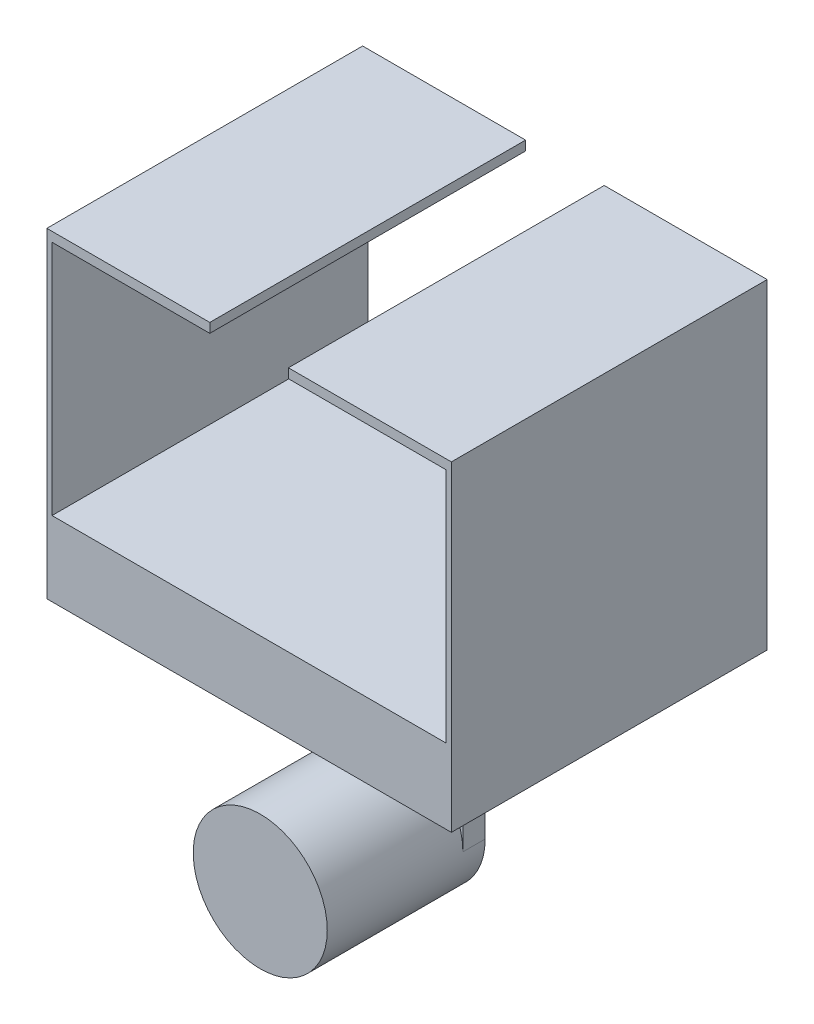
ISO-10303-21;
HEADER;
FILE_DESCRIPTION(('STEP AP214'),'2;1');
FILE_NAME('part.step','',(''),(''),'','','');
FILE_SCHEMA(('AUTOMOTIVE_DESIGN { 1 0 10303 214 1 1 1 1 }'));
ENDSEC;
DATA;
#1=APPLICATION_CONTEXT('core data for automotive mechanical design processes');
#2=APPLICATION_PROTOCOL_DEFINITION('international standard','automotive_design',2000,#1);
#3=PRODUCT_CONTEXT('',#1,'mechanical');
#4=PRODUCT('Part','Part','',(#3));
#5=PRODUCT_RELATED_PRODUCT_CATEGORY('part','',(#4));
#6=PRODUCT_DEFINITION_FORMATION('','',#4);
#7=PRODUCT_DEFINITION_CONTEXT('part definition',#1,'design');
#8=PRODUCT_DEFINITION('design','',#6,#7);
#9=PRODUCT_DEFINITION_SHAPE('','',#8);
#10=(LENGTH_UNIT() NAMED_UNIT(*) SI_UNIT(.MILLI.,.METRE.));
#11=(NAMED_UNIT(*) PLANE_ANGLE_UNIT() SI_UNIT($,.RADIAN.));
#12=(NAMED_UNIT(*) SI_UNIT($,.STERADIAN.) SOLID_ANGLE_UNIT());
#13=UNCERTAINTY_MEASURE_WITH_UNIT(LENGTH_MEASURE(1.E-05),#10,'distance_accuracy_value','');
#14=(GEOMETRIC_REPRESENTATION_CONTEXT(3) GLOBAL_UNCERTAINTY_ASSIGNED_CONTEXT((#13)) GLOBAL_UNIT_ASSIGNED_CONTEXT((#10,
#11,#12)) REPRESENTATION_CONTEXT('',''));
#15=CARTESIAN_POINT('',(0.,0.,0.));
#16=DIRECTION('',(0.,0.,1.));
#17=DIRECTION('',(1.,0.,0.));
#18=AXIS2_PLACEMENT_3D('',#15,#16,#17);
#19=CARTESIAN_POINT('',(-32.5374,77.0128,1.7907));
#20=DIRECTION('',(0.,0.,-1.));
#21=DIRECTION('',(-1.,0.,0.));
#22=AXIS2_PLACEMENT_3D('',#19,#20,#21);
#23=PLANE('',#22);
#24=DIRECTION('',(0.,-1.,0.));
#25=VECTOR('',#24,1.);
#26=CARTESIAN_POINT('',(-6.3246,75.4888,1.79069999999999));
#27=LINE('',#26,#25);
#28=CARTESIAN_POINT('',(-6.3246,77.0128,1.79069999999999));
#29=VERTEX_POINT('',#28);
#30=CARTESIAN_POINT('',(-6.3246,75.4888,1.79069999999999));
#31=VERTEX_POINT('',#30);
#32=EDGE_CURVE('E888',#29,#31,#27,.T.);
#33=ORIENTED_EDGE('',*,*,#32,.F.);
#34=DIRECTION('',(1.,0.,0.));
#35=VECTOR('',#34,1.);
#36=CARTESIAN_POINT('',(-32.5374,77.0128,1.7907));
#37=LINE('',#36,#35);
#38=CARTESIAN_POINT('',(-32.5374,77.0128,1.7907));
#39=VERTEX_POINT('',#38);
#40=EDGE_CURVE('E1052',#39,#29,#37,.T.);
#41=ORIENTED_EDGE('',*,*,#40,.F.);
#42=DIRECTION('',(0.,-1.,0.));
#43=VECTOR('',#42,1.);
#44=CARTESIAN_POINT('',(-32.5374,77.0128,1.7907));
#45=LINE('',#44,#43);
#46=CARTESIAN_POINT('',(-32.5374,25.4,1.7907));
#47=VERTEX_POINT('',#46);
#48=EDGE_CURVE('E1084',#39,#47,#45,.T.);
#49=ORIENTED_EDGE('',*,*,#48,.T.);
#50=DIRECTION('',(1.,0.,0.));
#51=VECTOR('',#50,1.);
#52=CARTESIAN_POINT('',(-32.5374,25.4,1.7907));
#53=LINE('',#52,#51);
#54=CARTESIAN_POINT('',(32.5374,25.4,1.79069999999997));
#55=VERTEX_POINT('',#54);
#56=EDGE_CURVE('E1067',#47,#55,#53,.T.);
#57=ORIENTED_EDGE('',*,*,#56,.T.);
#58=DIRECTION('',(0.,-1.,0.));
#59=VECTOR('',#58,1.);
#60=CARTESIAN_POINT('',(32.5374,77.0128,1.79069999999997));
#61=LINE('',#60,#59);
#62=CARTESIAN_POINT('',(32.5374,77.0128,1.79069999999997));
#63=VERTEX_POINT('',#62);
#64=EDGE_CURVE('E1081',#63,#55,#61,.T.);
#65=ORIENTED_EDGE('',*,*,#64,.F.);
#66=CARTESIAN_POINT('',(6.3246,77.0128,1.79069999999999));
#67=VERTEX_POINT('',#66);
#68=EDGE_CURVE('E1046',#67,#63,#37,.T.);
#69=ORIENTED_EDGE('',*,*,#68,.F.);
#70=DIRECTION('',(0.,1.,0.));
#71=VECTOR('',#70,1.);
#72=CARTESIAN_POINT('',(6.3246,75.4888,1.79069999999999));
#73=LINE('',#72,#71);
#74=CARTESIAN_POINT('',(6.3246,75.4888,1.79069999999999));
#75=VERTEX_POINT('',#74);
#76=EDGE_CURVE('E995',#75,#67,#73,.T.);
#77=ORIENTED_EDGE('',*,*,#76,.F.);
#78=DIRECTION('',(-1.,0.,0.));
#79=VECTOR('',#78,1.);
#80=CARTESIAN_POINT('',(-31.70428,75.4888,1.79069999999999));
#81=LINE('',#80,#79);
#82=CARTESIAN_POINT('',(31.70428,75.4888,1.79069999999999));
#83=VERTEX_POINT('',#82);
#84=EDGE_CURVE('E1027',#83,#75,#81,.T.);
#85=ORIENTED_EDGE('',*,*,#84,.F.);
#86=DIRECTION('',(0.,1.,0.));
#87=VECTOR('',#86,1.);
#88=CARTESIAN_POINT('',(31.70428,37.4142,1.79069999999999));
#89=LINE('',#88,#87);
#90=CARTESIAN_POINT('',(31.70428,37.4142,1.79069999999999));
#91=VERTEX_POINT('',#90);
#92=EDGE_CURVE('E1023',#91,#83,#89,.T.);
#93=ORIENTED_EDGE('',*,*,#92,.F.);
#94=DIRECTION('',(1.,0.,0.));
#95=VECTOR('',#94,1.);
#96=CARTESIAN_POINT('',(-31.70428,37.4142,1.79069999999999));
#97=LINE('',#96,#95);
#98=CARTESIAN_POINT('',(-31.70428,37.4142,1.7907));
#99=VERTEX_POINT('',#98);
#100=EDGE_CURVE('E1018',#99,#91,#97,.T.);
#101=ORIENTED_EDGE('',*,*,#100,.F.);
#102=DIRECTION('',(0.,-1.,0.));
#103=VECTOR('',#102,1.);
#104=CARTESIAN_POINT('',(-31.70428,37.4142,1.79069999999999));
#105=LINE('',#104,#103);
#106=CARTESIAN_POINT('',(-31.70428,75.4888,1.79069999999999));
#107=VERTEX_POINT('',#106);
#108=EDGE_CURVE('E1012',#107,#99,#105,.T.);
#109=ORIENTED_EDGE('',*,*,#108,.F.);
#110=EDGE_CURVE('E1030',#31,#107,#81,.T.);
#111=ORIENTED_EDGE('',*,*,#110,.F.);
#112=EDGE_LOOP('',(#33,#41,#49,#57,#65,#69,#77,#85,#93,#101,#109,#111));
#113=FACE_BOUND('',#112,.T.);
#114=ADVANCED_FACE('F863',(#113),#23,.F.);
#115=CARTESIAN_POINT('',(0.,77.0128,0.));
#116=DIRECTION('',(0.,1.,0.));
#117=DIRECTION('',(0.,0.,1.));
#118=AXIS2_PLACEMENT_3D('',#115,#116,#117);
#119=PLANE('',#118);
#120=DIRECTION('',(-1.,0.,0.));
#121=VECTOR('',#120,1.);
#122=CARTESIAN_POINT('',(-32.5374,77.0128,-49.0093));
#123=LINE('',#122,#121);
#124=CARTESIAN_POINT('',(32.5374,77.0128,-49.0093));
#125=VERTEX_POINT('',#124);
#126=CARTESIAN_POINT('',(6.3246,77.0128,-49.0093));
#127=VERTEX_POINT('',#126);
#128=EDGE_CURVE('E1059',#125,#127,#123,.T.);
#129=ORIENTED_EDGE('',*,*,#128,.T.);
#130=DIRECTION('',(0.,0.,1.));
#131=VECTOR('',#130,1.);
#132=CARTESIAN_POINT('',(6.3246,77.0128,-49.0093));
#133=LINE('',#132,#131);
#134=EDGE_CURVE('E1320',#127,#67,#133,.T.);
#135=ORIENTED_EDGE('',*,*,#134,.T.);
#136=ORIENTED_EDGE('',*,*,#68,.T.);
#137=DIRECTION('',(0.,0.,-1.));
#138=VECTOR('',#137,1.);
#139=CARTESIAN_POINT('',(32.5374,77.0128,-49.0093));
#140=LINE('',#139,#138);
#141=EDGE_CURVE('E1053',#63,#125,#140,.T.);
#142=ORIENTED_EDGE('',*,*,#141,.T.);
#143=EDGE_LOOP('',(#129,#135,#136,#142));
#144=FACE_BOUND('',#143,.T.);
#145=ADVANCED_FACE('F1146',(#144),#119,.T.);
#146=CARTESIAN_POINT('',(-31.70428,75.4888,-49.0093));
#147=DIRECTION('',(0.,1.,0.));
#148=DIRECTION('',(-1.,0.,0.));
#149=AXIS2_PLACEMENT_3D('',#146,#147,#148);
#150=PLANE('',#149);
#151=DIRECTION('',(0.,0.,1.));
#152=VECTOR('',#151,1.);
#153=CARTESIAN_POINT('',(6.3246,75.4888,-49.0093));
#154=LINE('',#153,#152);
#155=CARTESIAN_POINT('',(6.3246,75.4888,-49.0093));
#156=VERTEX_POINT('',#155);
#157=EDGE_CURVE('E981',#156,#75,#154,.T.);
#158=ORIENTED_EDGE('',*,*,#157,.F.);
#159=DIRECTION('',(-1.,0.,0.));
#160=VECTOR('',#159,1.);
#161=CARTESIAN_POINT('',(-31.70428,75.4888,-49.0093));
#162=LINE('',#161,#160);
#163=CARTESIAN_POINT('',(31.70428,75.4888,-49.0093));
#164=VERTEX_POINT('',#163);
#165=EDGE_CURVE('E1005',#164,#156,#162,.T.);
#166=ORIENTED_EDGE('',*,*,#165,.F.);
#167=DIRECTION('',(0.,0.,1.));
#168=VECTOR('',#167,1.);
#169=CARTESIAN_POINT('',(31.70428,75.4888,-49.0093));
#170=LINE('',#169,#168);
#171=EDGE_CURVE('E1036',#164,#83,#170,.T.);
#172=ORIENTED_EDGE('',*,*,#171,.T.);
#173=ORIENTED_EDGE('',*,*,#84,.T.);
#174=EDGE_LOOP('',(#158,#166,#172,#173));
#175=FACE_BOUND('',#174,.T.);
#176=ADVANCED_FACE('F1137',(#175),#150,.F.);
#177=CARTESIAN_POINT('',(0.,0.,-25.4));
#178=DIRECTION('',(0.,0.,1.));
#179=DIRECTION('',(1.,0.,0.));
#180=AXIS2_PLACEMENT_3D('',#177,#178,#179);
#181=CYLINDRICAL_SURFACE('',#180,10.7823);
#182=DIRECTION('',(0.,0.,-1.));
#183=VECTOR('',#182,1.);
#184=CARTESIAN_POINT('',(10.7823,0.,-21.8186));
#185=LINE('',#184,#183);
#186=CARTESIAN_POINT('',(10.7823,0.,-21.8186));
#187=VERTEX_POINT('',#186);
#188=CARTESIAN_POINT('',(10.7823,0.,-25.4));
#189=VERTEX_POINT('',#188);
#190=EDGE_CURVE('E1102',#187,#189,#185,.T.);
#191=ORIENTED_EDGE('',*,*,#190,.F.);
#192=CARTESIAN_POINT('',(0.,0.,-21.8186));
#193=DIRECTION('',(0.,0.,-1.));
#194=DIRECTION('',(-1.,0.,0.));
#195=AXIS2_PLACEMENT_3D('',#192,#193,#194);
#196=CIRCLE('',#195,10.7823);
#197=CARTESIAN_POINT('',(-10.7823,0.,-21.8186));
#198=VERTEX_POINT('',#197);
#199=EDGE_CURVE('E14',#187,#198,#196,.F.);
#200=ORIENTED_EDGE('',*,*,#199,.T.);
#201=DIRECTION('',(0.,0.,-1.));
#202=VECTOR('',#201,1.);
#203=CARTESIAN_POINT('',(-10.7823,0.,-21.8186));
#204=LINE('',#203,#202);
#205=CARTESIAN_POINT('',(-10.7823,0.,-25.4));
#206=VERTEX_POINT('',#205);
#207=EDGE_CURVE('E1118',#198,#206,#204,.T.);
#208=ORIENTED_EDGE('',*,*,#207,.T.);
#209=CARTESIAN_POINT('',(0.,0.,-25.4));
#210=DIRECTION('',(0.,0.,1.));
#211=DIRECTION('',(1.,0.,0.));
#212=AXIS2_PLACEMENT_3D('',#209,#210,#211);
#213=CIRCLE('',#212,10.7823);
#214=EDGE_CURVE('E874',#206,#189,#213,.T.);
#215=ORIENTED_EDGE('',*,*,#214,.T.);
#216=EDGE_LOOP('',(#191,#200,#208,#215));
#217=FACE_BOUND('',#216,.T.);
#218=CARTESIAN_POINT('',(0.,0.,0.));
#219=DIRECTION('',(0.,0.,1.));
#220=DIRECTION('',(1.,0.,0.));
#221=AXIS2_PLACEMENT_3D('',#218,#219,#220);
#222=CIRCLE('',#221,10.7823);
#223=CARTESIAN_POINT('',(10.7823,0.,0.));
#224=VERTEX_POINT('',#223);
#225=EDGE_CURVE('E1117',#224,#224,#222,.T.);
#226=ORIENTED_EDGE('',*,*,#225,.F.);
#227=EDGE_LOOP('',(#226));
#228=FACE_BOUND('',#227,.T.);
#229=ADVANCED_FACE('F869',(#217,#228),#181,.T.);
#230=CARTESIAN_POINT('',(0.,0.,-25.4));
#231=DIRECTION('',(0.,0.,1.));
#232=DIRECTION('',(1.,0.,0.));
#233=AXIS2_PLACEMENT_3D('',#230,#231,#232);
#234=PLANE('',#233);
#235=ORIENTED_EDGE('',*,*,#214,.F.);
#236=DIRECTION('',(0.,1.,0.));
#237=VECTOR('',#236,1.);
#238=CARTESIAN_POINT('',(-10.7823,0.,-25.4));
#239=LINE('',#238,#237);
#240=CARTESIAN_POINT('',(-10.7823,25.4,-25.4));
#241=VERTEX_POINT('',#240);
#242=EDGE_CURVE('E1109',#206,#241,#239,.T.);
#243=ORIENTED_EDGE('',*,*,#242,.T.);
#244=DIRECTION('',(1.,0.,0.));
#245=VECTOR('',#244,1.);
#246=CARTESIAN_POINT('',(-10.7823,25.4,-25.4));
#247=LINE('',#246,#245);
#248=CARTESIAN_POINT('',(10.7823,25.4,-25.4));
#249=VERTEX_POINT('',#248);
#250=EDGE_CURVE('E1094',#241,#249,#247,.T.);
#251=ORIENTED_EDGE('',*,*,#250,.T.);
#252=DIRECTION('',(0.,-1.,0.));
#253=VECTOR('',#252,1.);
#254=CARTESIAN_POINT('',(10.7823,0.,-25.4));
#255=LINE('',#254,#253);
#256=EDGE_CURVE('E1087',#249,#189,#255,.T.);
#257=ORIENTED_EDGE('',*,*,#256,.T.);
#258=EDGE_LOOP('',(#235,#243,#251,#257));
#259=FACE_BOUND('',#258,.T.);
#260=ADVANCED_FACE('F1138',(#259),#234,.F.);
#261=CARTESIAN_POINT('',(0.,0.,0.));
#262=DIRECTION('',(0.,0.,1.));
#263=DIRECTION('',(1.,0.,0.));
#264=AXIS2_PLACEMENT_3D('',#261,#262,#263);
#265=PLANE('',#264);
#266=ORIENTED_EDGE('',*,*,#225,.T.);
#267=EDGE_LOOP('',(#266));
#268=FACE_BOUND('',#267,.T.);
#269=ADVANCED_FACE('F1134',(#268),#265,.T.);
#270=CARTESIAN_POINT('',(10.7823,0.,-21.8186));
#271=DIRECTION('',(1.,0.,0.));
#272=DIRECTION('',(0.,0.,-1.));
#273=AXIS2_PLACEMENT_3D('',#270,#271,#272);
#274=PLANE('',#273);
#275=ORIENTED_EDGE('',*,*,#256,.F.);
#276=DIRECTION('',(0.,0.,-1.));
#277=VECTOR('',#276,1.);
#278=CARTESIAN_POINT('',(10.7823,25.4,-21.8186));
#279=LINE('',#278,#277);
#280=CARTESIAN_POINT('',(10.7823,25.4,-21.8186));
#281=VERTEX_POINT('',#280);
#282=EDGE_CURVE('E1115',#281,#249,#279,.T.);
#283=ORIENTED_EDGE('',*,*,#282,.F.);
#284=DIRECTION('',(0.,-1.,0.));
#285=VECTOR('',#284,1.);
#286=CARTESIAN_POINT('',(10.7823,0.,-21.8186));
#287=LINE('',#286,#285);
#288=EDGE_CURVE('E1089',#281,#187,#287,.T.);
#289=ORIENTED_EDGE('',*,*,#288,.T.);
#290=ORIENTED_EDGE('',*,*,#190,.T.);
#291=EDGE_LOOP('',(#275,#283,#289,#290));
#292=FACE_BOUND('',#291,.T.);
#293=ADVANCED_FACE('F1172',(#292),#274,.T.);
#294=CARTESIAN_POINT('',(-10.7823,0.,-21.8186));
#295=DIRECTION('',(-1.,0.,0.));
#296=DIRECTION('',(0.,0.,1.));
#297=AXIS2_PLACEMENT_3D('',#294,#295,#296);
#298=PLANE('',#297);
#299=ORIENTED_EDGE('',*,*,#242,.F.);
#300=ORIENTED_EDGE('',*,*,#207,.F.);
#301=DIRECTION('',(0.,1.,0.));
#302=VECTOR('',#301,1.);
#303=CARTESIAN_POINT('',(-10.7823,0.,-21.8186));
#304=LINE('',#303,#302);
#305=CARTESIAN_POINT('',(-10.7823,25.4,-21.8186));
#306=VERTEX_POINT('',#305);
#307=EDGE_CURVE('E1093',#198,#306,#304,.T.);
#308=ORIENTED_EDGE('',*,*,#307,.T.);
#309=DIRECTION('',(0.,0.,-1.));
#310=VECTOR('',#309,1.);
#311=CARTESIAN_POINT('',(-10.7823,25.4,-21.8186));
#312=LINE('',#311,#310);
#313=EDGE_CURVE('E1120',#306,#241,#312,.T.);
#314=ORIENTED_EDGE('',*,*,#313,.T.);
#315=EDGE_LOOP('',(#299,#300,#308,#314));
#316=FACE_BOUND('',#315,.T.);
#317=ADVANCED_FACE('F1174',(#316),#298,.T.);
#318=CARTESIAN_POINT('',(0.,0.,-21.8186));
#319=DIRECTION('',(0.,0.,-1.));
#320=DIRECTION('',(-1.,0.,0.));
#321=AXIS2_PLACEMENT_3D('',#318,#319,#320);
#322=PLANE('',#321);
#323=ORIENTED_EDGE('',*,*,#199,.F.);
#324=ORIENTED_EDGE('',*,*,#288,.F.);
#325=DIRECTION('',(1.,0.,0.));
#326=VECTOR('',#325,1.);
#327=CARTESIAN_POINT('',(-10.7823,25.4,-21.8186));
#328=LINE('',#327,#326);
#329=EDGE_CURVE('E1099',#306,#281,#328,.T.);
#330=ORIENTED_EDGE('',*,*,#329,.F.);
#331=ORIENTED_EDGE('',*,*,#307,.F.);
#332=EDGE_LOOP('',(#323,#324,#330,#331));
#333=FACE_BOUND('',#332,.T.);
#334=ADVANCED_FACE('F1167',(#333),#322,.F.);
#335=CARTESIAN_POINT('',(-32.5374,77.0128,-49.0093));
#336=DIRECTION('',(1.,0.,0.));
#337=DIRECTION('',(0.,0.,-1.));
#338=AXIS2_PLACEMENT_3D('',#335,#336,#337);
#339=PLANE('',#338);
#340=DIRECTION('',(0.,0.,1.));
#341=VECTOR('',#340,1.);
#342=CARTESIAN_POINT('',(-32.5374,25.4,-49.0093));
#343=LINE('',#342,#341);
#344=CARTESIAN_POINT('',(-32.5374,25.4,-49.0093));
#345=VERTEX_POINT('',#344);
#346=EDGE_CURVE('E1033',#345,#47,#343,.T.);
#347=ORIENTED_EDGE('',*,*,#346,.T.);
#348=ORIENTED_EDGE('',*,*,#48,.F.);
#349=DIRECTION('',(0.,0.,1.));
#350=VECTOR('',#349,1.);
#351=CARTESIAN_POINT('',(-32.5374,77.0128,-49.0093));
#352=LINE('',#351,#350);
#353=CARTESIAN_POINT('',(-32.5374,77.0128,-49.0093));
#354=VERTEX_POINT('',#353);
#355=EDGE_CURVE('E1042',#354,#39,#352,.T.);
#356=ORIENTED_EDGE('',*,*,#355,.F.);
#357=DIRECTION('',(0.,-1.,0.));
#358=VECTOR('',#357,1.);
#359=CARTESIAN_POINT('',(-32.5374,77.0128,-49.0093));
#360=LINE('',#359,#358);
#361=EDGE_CURVE('E1061',#354,#345,#360,.T.);
#362=ORIENTED_EDGE('',*,*,#361,.T.);
#363=EDGE_LOOP('',(#347,#348,#356,#362));
#364=FACE_BOUND('',#363,.T.);
#365=ADVANCED_FACE('F1161',(#364),#339,.F.);
#366=CARTESIAN_POINT('',(32.5374,77.0128,-49.0093));
#367=DIRECTION('',(-1.,0.,0.));
#368=DIRECTION('',(0.,0.,1.));
#369=AXIS2_PLACEMENT_3D('',#366,#367,#368);
#370=PLANE('',#369);
#371=DIRECTION('',(0.,0.,-1.));
#372=VECTOR('',#371,1.);
#373=CARTESIAN_POINT('',(32.5374,25.4,-49.0093));
#374=LINE('',#373,#372);
#375=CARTESIAN_POINT('',(32.5374,25.4,-49.0093));
#376=VERTEX_POINT('',#375);
#377=EDGE_CURVE('E1066',#55,#376,#374,.T.);
#378=ORIENTED_EDGE('',*,*,#377,.T.);
#379=DIRECTION('',(0.,-1.,0.));
#380=VECTOR('',#379,1.);
#381=CARTESIAN_POINT('',(32.5374,77.0128,-49.0093));
#382=LINE('',#381,#380);
#383=EDGE_CURVE('E1080',#125,#376,#382,.T.);
#384=ORIENTED_EDGE('',*,*,#383,.F.);
#385=ORIENTED_EDGE('',*,*,#141,.F.);
#386=ORIENTED_EDGE('',*,*,#64,.T.);
#387=EDGE_LOOP('',(#378,#384,#385,#386));
#388=FACE_BOUND('',#387,.T.);
#389=ADVANCED_FACE('F1165',(#388),#370,.F.);
#390=CARTESIAN_POINT('',(-32.5374,77.0128,-49.0093));
#391=DIRECTION('',(0.,0.,1.));
#392=DIRECTION('',(1.,0.,0.));
#393=AXIS2_PLACEMENT_3D('',#390,#391,#392);
#394=PLANE('',#393);
#395=CARTESIAN_POINT('',(-6.3246,77.0128,-49.0093));
#396=VERTEX_POINT('',#395);
#397=EDGE_CURVE('E994',#396,#354,#123,.T.);
#398=ORIENTED_EDGE('',*,*,#397,.F.);
#399=DIRECTION('',(0.,-1.,0.));
#400=VECTOR('',#399,1.);
#401=CARTESIAN_POINT('',(-6.3246,75.4888,-49.0093));
#402=LINE('',#401,#400);
#403=CARTESIAN_POINT('',(-6.3246,75.4888,-49.0093));
#404=VERTEX_POINT('',#403);
#405=EDGE_CURVE('E980',#396,#404,#402,.T.);
#406=ORIENTED_EDGE('',*,*,#405,.T.);
#407=CARTESIAN_POINT('',(-31.70428,75.4888,-49.0093));
#408=VERTEX_POINT('',#407);
#409=EDGE_CURVE('E988',#404,#408,#162,.T.);
#410=ORIENTED_EDGE('',*,*,#409,.T.);
#411=DIRECTION('',(0.,-1.,0.));
#412=VECTOR('',#411,1.);
#413=CARTESIAN_POINT('',(-31.70428,37.4142,-49.0093));
#414=LINE('',#413,#412);
#415=CARTESIAN_POINT('',(-31.70428,37.4142,-49.0093));
#416=VERTEX_POINT('',#415);
#417=EDGE_CURVE('E1035',#408,#416,#414,.T.);
#418=ORIENTED_EDGE('',*,*,#417,.T.);
#419=DIRECTION('',(1.,0.,0.));
#420=VECTOR('',#419,1.);
#421=CARTESIAN_POINT('',(-31.70428,37.4142,-49.0093));
#422=LINE('',#421,#420);
#423=CARTESIAN_POINT('',(31.70428,37.4142,-49.0093));
#424=VERTEX_POINT('',#423);
#425=EDGE_CURVE('E1013',#416,#424,#422,.T.);
#426=ORIENTED_EDGE('',*,*,#425,.T.);
#427=DIRECTION('',(0.,1.,0.));
#428=VECTOR('',#427,1.);
#429=CARTESIAN_POINT('',(31.70428,37.4142,-49.0093));
#430=LINE('',#429,#428);
#431=EDGE_CURVE('E1004',#424,#164,#430,.T.);
#432=ORIENTED_EDGE('',*,*,#431,.T.);
#433=ORIENTED_EDGE('',*,*,#165,.T.);
#434=DIRECTION('',(0.,1.,0.));
#435=VECTOR('',#434,1.);
#436=CARTESIAN_POINT('',(6.3246,75.4888,-49.0093));
#437=LINE('',#436,#435);
#438=EDGE_CURVE('E879',#156,#127,#437,.T.);
#439=ORIENTED_EDGE('',*,*,#438,.T.);
#440=ORIENTED_EDGE('',*,*,#128,.F.);
#441=ORIENTED_EDGE('',*,*,#383,.T.);
#442=DIRECTION('',(-1.,0.,0.));
#443=VECTOR('',#442,1.);
#444=CARTESIAN_POINT('',(-32.5374,25.4,-49.0093));
#445=LINE('',#444,#443);
#446=EDGE_CURVE('E1048',#376,#345,#445,.T.);
#447=ORIENTED_EDGE('',*,*,#446,.T.);
#448=ORIENTED_EDGE('',*,*,#361,.F.);
#449=EDGE_LOOP('',(#398,#406,#410,#418,#426,#432,#433,#439,#440,#441,#447,#448));
#450=FACE_BOUND('',#449,.T.);
#451=ADVANCED_FACE('F986',(#450),#394,.F.);
#452=DIRECTION('',(0.,0.,1.));
#453=VECTOR('',#452,1.);
#454=CARTESIAN_POINT('',(-6.3246,77.0128,-49.0093));
#455=LINE('',#454,#453);
#456=EDGE_CURVE('E1017',#396,#29,#455,.T.);
#457=ORIENTED_EDGE('',*,*,#456,.F.);
#458=ORIENTED_EDGE('',*,*,#397,.T.);
#459=ORIENTED_EDGE('',*,*,#355,.T.);
#460=ORIENTED_EDGE('',*,*,#40,.T.);
#461=EDGE_LOOP('',(#457,#458,#459,#460));
#462=FACE_BOUND('',#461,.T.);
#463=ADVANCED_FACE('F1158',(#462),#119,.T.);
#464=CARTESIAN_POINT('',(0.,25.4,0.));
#465=DIRECTION('',(0.,1.,0.));
#466=DIRECTION('',(0.,0.,1.));
#467=AXIS2_PLACEMENT_3D('',#464,#465,#466);
#468=PLANE('',#467);
#469=ORIENTED_EDGE('',*,*,#250,.F.);
#470=ORIENTED_EDGE('',*,*,#313,.F.);
#471=ORIENTED_EDGE('',*,*,#329,.T.);
#472=ORIENTED_EDGE('',*,*,#282,.T.);
#473=EDGE_LOOP('',(#469,#470,#471,#472));
#474=FACE_BOUND('',#473,.T.);
#475=ORIENTED_EDGE('',*,*,#346,.F.);
#476=ORIENTED_EDGE('',*,*,#446,.F.);
#477=ORIENTED_EDGE('',*,*,#377,.F.);
#478=ORIENTED_EDGE('',*,*,#56,.F.);
#479=EDGE_LOOP('',(#475,#476,#477,#478));
#480=FACE_BOUND('',#479,.T.);
#481=ADVANCED_FACE('F1238',(#474,#480),#468,.F.);
#482=CARTESIAN_POINT('',(-31.70428,37.4142,-49.0093));
#483=DIRECTION('',(-1.,0.,0.));
#484=DIRECTION('',(0.,-1.,0.));
#485=AXIS2_PLACEMENT_3D('',#482,#483,#484);
#486=PLANE('',#485);
#487=ORIENTED_EDGE('',*,*,#108,.T.);
#488=DIRECTION('',(0.,0.,1.));
#489=VECTOR('',#488,1.);
#490=CARTESIAN_POINT('',(-31.70428,37.4142,-49.0093));
#491=LINE('',#490,#489);
#492=EDGE_CURVE('E1010',#416,#99,#491,.T.);
#493=ORIENTED_EDGE('',*,*,#492,.F.);
#494=ORIENTED_EDGE('',*,*,#417,.F.);
#495=DIRECTION('',(0.,0.,1.));
#496=VECTOR('',#495,1.);
#497=CARTESIAN_POINT('',(-31.70428,75.4888,-49.0093));
#498=LINE('',#497,#496);
#499=EDGE_CURVE('E998',#408,#107,#498,.T.);
#500=ORIENTED_EDGE('',*,*,#499,.T.);
#501=EDGE_LOOP('',(#487,#493,#494,#500));
#502=FACE_BOUND('',#501,.T.);
#503=ADVANCED_FACE('F1246',(#502),#486,.F.);
#504=ORIENTED_EDGE('',*,*,#409,.F.);
#505=DIRECTION('',(0.,0.,1.));
#506=VECTOR('',#505,1.);
#507=CARTESIAN_POINT('',(-6.3246,75.4888,-49.0093));
#508=LINE('',#507,#506);
#509=EDGE_CURVE('E975',#404,#31,#508,.T.);
#510=ORIENTED_EDGE('',*,*,#509,.T.);
#511=ORIENTED_EDGE('',*,*,#110,.T.);
#512=ORIENTED_EDGE('',*,*,#499,.F.);
#513=EDGE_LOOP('',(#504,#510,#511,#512));
#514=FACE_BOUND('',#513,.T.);
#515=ADVANCED_FACE('F996',(#514),#150,.F.);
#516=CARTESIAN_POINT('',(31.70428,37.4142,-49.0093));
#517=DIRECTION('',(1.,0.,0.));
#518=DIRECTION('',(0.,1.,0.));
#519=AXIS2_PLACEMENT_3D('',#516,#517,#518);
#520=PLANE('',#519);
#521=ORIENTED_EDGE('',*,*,#92,.T.);
#522=ORIENTED_EDGE('',*,*,#171,.F.);
#523=ORIENTED_EDGE('',*,*,#431,.F.);
#524=DIRECTION('',(0.,0.,1.));
#525=VECTOR('',#524,1.);
#526=CARTESIAN_POINT('',(31.70428,37.4142,-49.0093));
#527=LINE('',#526,#525);
#528=EDGE_CURVE('E1038',#424,#91,#527,.T.);
#529=ORIENTED_EDGE('',*,*,#528,.T.);
#530=EDGE_LOOP('',(#521,#522,#523,#529));
#531=FACE_BOUND('',#530,.T.);
#532=ADVANCED_FACE('F1267',(#531),#520,.F.);
#533=CARTESIAN_POINT('',(-31.70428,37.4142,-49.0093));
#534=DIRECTION('',(0.,-1.,0.));
#535=DIRECTION('',(1.,0.,0.));
#536=AXIS2_PLACEMENT_3D('',#533,#534,#535);
#537=PLANE('',#536);
#538=ORIENTED_EDGE('',*,*,#100,.T.);
#539=ORIENTED_EDGE('',*,*,#528,.F.);
#540=ORIENTED_EDGE('',*,*,#425,.F.);
#541=ORIENTED_EDGE('',*,*,#492,.T.);
#542=EDGE_LOOP('',(#538,#539,#540,#541));
#543=FACE_BOUND('',#542,.T.);
#544=ADVANCED_FACE('F1272',(#543),#537,.F.);
#545=CARTESIAN_POINT('',(6.3246,75.4888,-49.0093));
#546=DIRECTION('',(1.,0.,0.));
#547=DIRECTION('',(0.,0.,-1.));
#548=AXIS2_PLACEMENT_3D('',#545,#546,#547);
#549=PLANE('',#548);
#550=ORIENTED_EDGE('',*,*,#76,.T.);
#551=ORIENTED_EDGE('',*,*,#134,.F.);
#552=ORIENTED_EDGE('',*,*,#438,.F.);
#553=ORIENTED_EDGE('',*,*,#157,.T.);
#554=EDGE_LOOP('',(#550,#551,#552,#553));
#555=FACE_BOUND('',#554,.T.);
#556=ADVANCED_FACE('F1282',(#555),#549,.F.);
#557=CARTESIAN_POINT('',(-6.3246,75.4888,-49.0093));
#558=DIRECTION('',(-1.,0.,0.));
#559=DIRECTION('',(0.,0.,1.));
#560=AXIS2_PLACEMENT_3D('',#557,#558,#559);
#561=PLANE('',#560);
#562=ORIENTED_EDGE('',*,*,#32,.T.);
#563=ORIENTED_EDGE('',*,*,#509,.F.);
#564=ORIENTED_EDGE('',*,*,#405,.F.);
#565=ORIENTED_EDGE('',*,*,#456,.T.);
#566=EDGE_LOOP('',(#562,#563,#564,#565));
#567=FACE_BOUND('',#566,.T.);
#568=ADVANCED_FACE('F976',(#567),#561,.F.);
#569=CLOSED_SHELL('',(#114,#145,#176,#229,#260,#269,#293,#317,#334,#365,#389,#451,#463,#481,
#503,#515,#532,#544,#556,#568));
#570=MANIFOLD_SOLID_BREP('B2',#569);
#571=ADVANCED_BREP_SHAPE_REPRESENTATION('',(#18,#570),#14);
#572=SHAPE_DEFINITION_REPRESENTATION(#9,#571);
ENDSEC;
END-ISO-10303-21;
